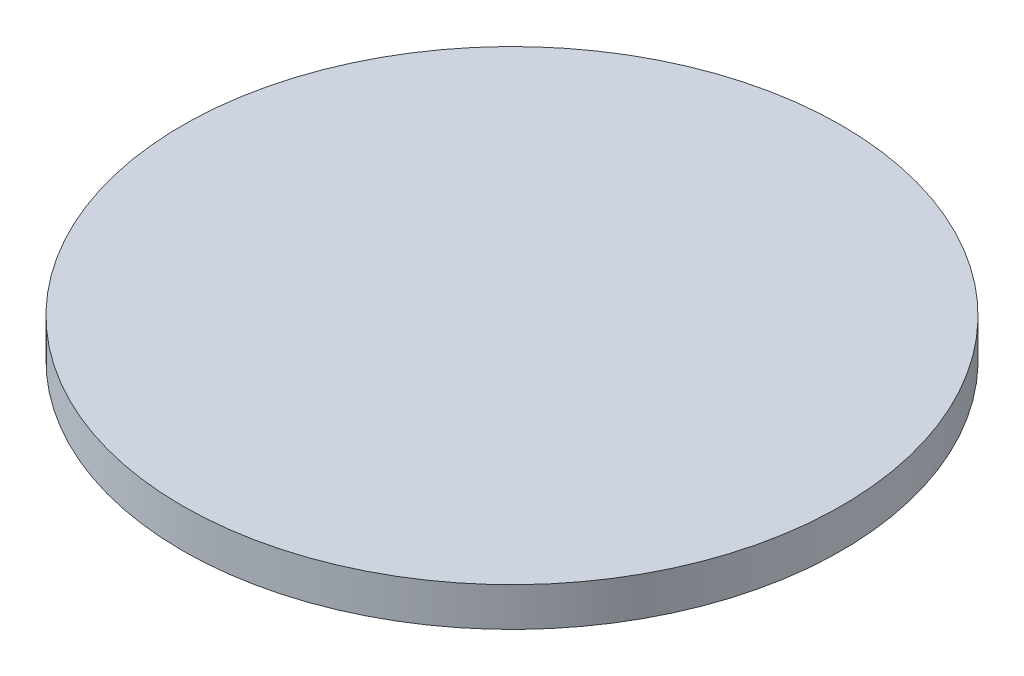
ISO-10303-21;
HEADER;
FILE_DESCRIPTION(('STEP AP214'),'2;1');
FILE_NAME('part.step','',(''),(''),'','','');
FILE_SCHEMA(('AUTOMOTIVE_DESIGN { 1 0 10303 214 1 1 1 1 }'));
ENDSEC;
DATA;
#1=APPLICATION_CONTEXT('core data for automotive mechanical design processes');
#2=APPLICATION_PROTOCOL_DEFINITION('international standard','automotive_design',2000,#1);
#3=PRODUCT_CONTEXT('',#1,'mechanical');
#4=PRODUCT('Part','Part','',(#3));
#5=PRODUCT_RELATED_PRODUCT_CATEGORY('part','',(#4));
#6=PRODUCT_DEFINITION_FORMATION('','',#4);
#7=PRODUCT_DEFINITION_CONTEXT('part definition',#1,'design');
#8=PRODUCT_DEFINITION('design','',#6,#7);
#9=PRODUCT_DEFINITION_SHAPE('','',#8);
#10=(LENGTH_UNIT() NAMED_UNIT(*) SI_UNIT(.MILLI.,.METRE.));
#11=(NAMED_UNIT(*) PLANE_ANGLE_UNIT() SI_UNIT($,.RADIAN.));
#12=(NAMED_UNIT(*) SI_UNIT($,.STERADIAN.) SOLID_ANGLE_UNIT());
#13=UNCERTAINTY_MEASURE_WITH_UNIT(LENGTH_MEASURE(1.E-05),#10,'distance_accuracy_value','');
#14=(GEOMETRIC_REPRESENTATION_CONTEXT(3) GLOBAL_UNCERTAINTY_ASSIGNED_CONTEXT((#13)) GLOBAL_UNIT_ASSIGNED_CONTEXT((#10,
#11,#12)) REPRESENTATION_CONTEXT('',''));
#15=CARTESIAN_POINT('',(0.,0.,0.));
#16=DIRECTION('',(0.,0.,1.));
#17=DIRECTION('',(1.,0.,0.));
#18=AXIS2_PLACEMENT_3D('',#15,#16,#17);
#19=CARTESIAN_POINT('',(0.,2.,0.));
#20=DIRECTION('',(0.,-1.,0.));
#21=DIRECTION('',(0.,0.,-1.));
#22=AXIS2_PLACEMENT_3D('',#19,#20,#21);
#23=CYLINDRICAL_SURFACE('',#22,17.);
#24=CARTESIAN_POINT('',(0.,2.,0.));
#25=DIRECTION('',(0.,1.,0.));
#26=DIRECTION('',(0.,0.,1.));
#27=AXIS2_PLACEMENT_3D('',#24,#25,#26);
#28=CIRCLE('',#27,17.);
#29=CARTESIAN_POINT('',(0.,2.,17.));
#30=VERTEX_POINT('',#29);
#31=EDGE_CURVE('E10',#30,#30,#28,.T.);
#32=ORIENTED_EDGE('',*,*,#31,.F.);
#33=EDGE_LOOP('',(#32));
#34=FACE_BOUND('',#33,.T.);
#35=CARTESIAN_POINT('',(0.,0.,0.));
#36=DIRECTION('',(0.,1.,0.));
#37=DIRECTION('',(0.,0.,1.));
#38=AXIS2_PLACEMENT_3D('',#35,#36,#37);
#39=CIRCLE('',#38,17.);
#40=CARTESIAN_POINT('',(0.,0.,17.));
#41=VERTEX_POINT('',#40);
#42=EDGE_CURVE('E38',#41,#41,#39,.T.);
#43=ORIENTED_EDGE('',*,*,#42,.T.);
#44=EDGE_LOOP('',(#43));
#45=FACE_BOUND('',#44,.T.);
#46=ADVANCED_FACE('F35',(#34,#45),#23,.T.);
#47=CARTESIAN_POINT('',(0.,2.,0.));
#48=DIRECTION('',(0.,1.,0.));
#49=DIRECTION('',(0.,0.,1.));
#50=AXIS2_PLACEMENT_3D('',#47,#48,#49);
#51=PLANE('',#50);
#52=ORIENTED_EDGE('',*,*,#31,.T.);
#53=EDGE_LOOP('',(#52));
#54=FACE_BOUND('',#53,.T.);
#55=ADVANCED_FACE('F50',(#54),#51,.T.);
#56=CARTESIAN_POINT('',(0.,0.,0.));
#57=DIRECTION('',(0.,1.,0.));
#58=DIRECTION('',(0.,0.,1.));
#59=AXIS2_PLACEMENT_3D('',#56,#57,#58);
#60=PLANE('',#59);
#61=ORIENTED_EDGE('',*,*,#42,.F.);
#62=EDGE_LOOP('',(#61));
#63=FACE_BOUND('',#62,.T.);
#64=ADVANCED_FACE('F48',(#63),#60,.F.);
#65=CLOSED_SHELL('',(#46,#55,#64));
#66=MANIFOLD_SOLID_BREP('B2',#65);
#67=ADVANCED_BREP_SHAPE_REPRESENTATION('',(#18,#66),#14);
#68=SHAPE_DEFINITION_REPRESENTATION(#9,#67);
ENDSEC;
END-ISO-10303-21;
